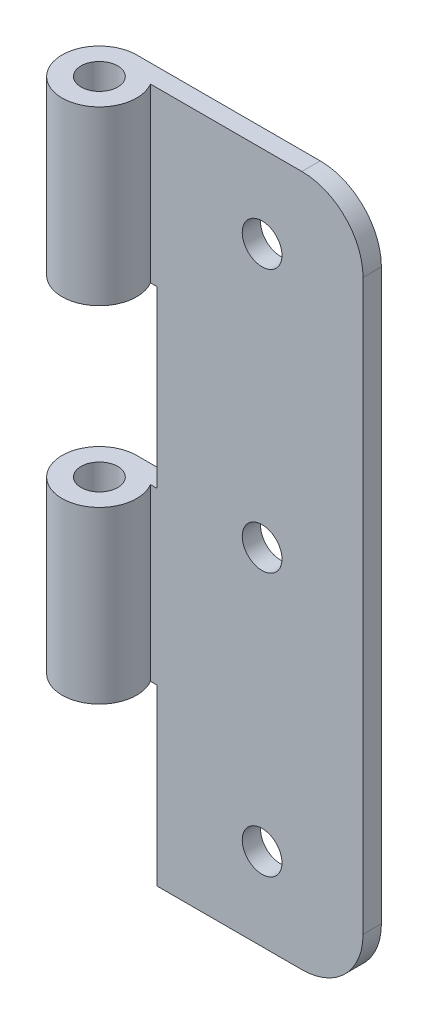
ISO-10303-21;
HEADER;
FILE_DESCRIPTION(('STEP AP214'),'2;1');
FILE_NAME('part.step','',(''),(''),'','','');
FILE_SCHEMA(('AUTOMOTIVE_DESIGN { 1 0 10303 214 1 1 1 1 }'));
ENDSEC;
DATA;
#1=APPLICATION_CONTEXT('core data for automotive mechanical design processes');
#2=APPLICATION_PROTOCOL_DEFINITION('international standard','automotive_design',2000,#1);
#3=PRODUCT_CONTEXT('',#1,'mechanical');
#4=PRODUCT('Part','Part','',(#3));
#5=PRODUCT_RELATED_PRODUCT_CATEGORY('part','',(#4));
#6=PRODUCT_DEFINITION_FORMATION('','',#4);
#7=PRODUCT_DEFINITION_CONTEXT('part definition',#1,'design');
#8=PRODUCT_DEFINITION('design','',#6,#7);
#9=PRODUCT_DEFINITION_SHAPE('','',#8);
#10=(LENGTH_UNIT() NAMED_UNIT(*) SI_UNIT(.MILLI.,.METRE.));
#11=(NAMED_UNIT(*) PLANE_ANGLE_UNIT() SI_UNIT($,.RADIAN.));
#12=(NAMED_UNIT(*) SI_UNIT($,.STERADIAN.) SOLID_ANGLE_UNIT());
#13=UNCERTAINTY_MEASURE_WITH_UNIT(LENGTH_MEASURE(1.E-05),#10,'distance_accuracy_value','');
#14=(GEOMETRIC_REPRESENTATION_CONTEXT(3) GLOBAL_UNCERTAINTY_ASSIGNED_CONTEXT((#13)) GLOBAL_UNIT_ASSIGNED_CONTEXT((#10,
#11,#12)) REPRESENTATION_CONTEXT('',''));
#15=CARTESIAN_POINT('',(0.,0.,0.));
#16=DIRECTION('',(0.,0.,1.));
#17=DIRECTION('',(1.,0.,0.));
#18=AXIS2_PLACEMENT_3D('',#15,#16,#17);
#19=CARTESIAN_POINT('',(0.,-56.5,0.));
#20=DIRECTION('',(0.,1.,0.));
#21=DIRECTION('',(0.,0.,1.));
#22=AXIS2_PLACEMENT_3D('',#19,#20,#21);
#23=CYLINDRICAL_SURFACE('',#22,3.);
#24=CARTESIAN_POINT('',(0.,56.5,0.));
#25=DIRECTION('',(0.,1.,0.));
#26=DIRECTION('',(0.,0.,1.));
#27=AXIS2_PLACEMENT_3D('',#24,#25,#26);
#28=CIRCLE('',#27,3.);
#29=CARTESIAN_POINT('',(0.,56.5,3.));
#30=VERTEX_POINT('',#29);
#31=EDGE_CURVE('E153',#30,#30,#28,.T.);
#32=ORIENTED_EDGE('',*,*,#31,.T.);
#33=EDGE_LOOP('',(#32));
#34=FACE_BOUND('',#33,.T.);
#35=CARTESIAN_POINT('',(0.,28.35,0.));
#36=DIRECTION('',(0.,1.,0.));
#37=DIRECTION('',(0.,0.,1.));
#38=AXIS2_PLACEMENT_3D('',#35,#36,#37);
#39=CIRCLE('',#38,3.);
#40=CARTESIAN_POINT('',(0.,28.35,3.));
#41=VERTEX_POINT('',#40);
#42=EDGE_CURVE('E183',#41,#41,#39,.F.);
#43=ORIENTED_EDGE('',*,*,#42,.T.);
#44=EDGE_LOOP('',(#43));
#45=FACE_BOUND('',#44,.T.);
#46=ADVANCED_FACE('F17',(#34,#45),#23,.F.);
#47=CARTESIAN_POINT('',(0.,-56.5,0.));
#48=DIRECTION('',(0.,1.,0.));
#49=DIRECTION('',(0.,0.,1.));
#50=AXIS2_PLACEMENT_3D('',#47,#48,#49);
#51=CYLINDRICAL_SURFACE('',#50,3.);
#52=CARTESIAN_POINT('',(0.,-0.199999999999999,0.));
#53=DIRECTION('',(0.,1.,0.));
#54=DIRECTION('',(0.,0.,1.));
#55=AXIS2_PLACEMENT_3D('',#52,#53,#54);
#56=CIRCLE('',#55,3.);
#57=CARTESIAN_POINT('',(0.,-0.199999999999999,3.));
#58=VERTEX_POINT('',#57);
#59=EDGE_CURVE('E144',#58,#58,#56,.T.);
#60=ORIENTED_EDGE('',*,*,#59,.T.);
#61=EDGE_LOOP('',(#60));
#62=FACE_BOUND('',#61,.T.);
#63=CARTESIAN_POINT('',(0.,-28.05,0.));
#64=DIRECTION('',(0.,1.,0.));
#65=DIRECTION('',(0.,0.,1.));
#66=AXIS2_PLACEMENT_3D('',#63,#64,#65);
#67=CIRCLE('',#66,3.);
#68=CARTESIAN_POINT('',(0.,-28.05,3.));
#69=VERTEX_POINT('',#68);
#70=EDGE_CURVE('E172',#69,#69,#67,.F.);
#71=ORIENTED_EDGE('',*,*,#70,.T.);
#72=EDGE_LOOP('',(#71));
#73=FACE_BOUND('',#72,.T.);
#74=ADVANCED_FACE('F481',(#62,#73),#51,.F.);
#75=CARTESIAN_POINT('',(30.,-46.5,-3.1));
#76=DIRECTION('',(0.,0.,1.));
#77=DIRECTION('',(1.,0.,0.));
#78=AXIS2_PLACEMENT_3D('',#75,#76,#77);
#79=PLANE('',#78);
#80=CARTESIAN_POINT('',(23.5,0.,-3.1));
#81=DIRECTION('',(0.,0.,-1.));
#82=DIRECTION('',(-1.,0.,0.));
#83=AXIS2_PLACEMENT_3D('',#80,#81,#82);
#84=CIRCLE('',#83,3.25);
#85=CARTESIAN_POINT('',(20.25,0.,-3.1));
#86=VERTEX_POINT('',#85);
#87=EDGE_CURVE('E167',#86,#86,#84,.T.);
#88=ORIENTED_EDGE('',*,*,#87,.T.);
#89=EDGE_LOOP('',(#88));
#90=FACE_BOUND('',#89,.T.);
#91=CARTESIAN_POINT('',(23.5,43.,-3.1));
#92=DIRECTION('',(0.,0.,-1.));
#93=DIRECTION('',(-1.,0.,0.));
#94=AXIS2_PLACEMENT_3D('',#91,#92,#93);
#95=CIRCLE('',#94,3.25);
#96=CARTESIAN_POINT('',(20.25,43.,-3.1));
#97=VERTEX_POINT('',#96);
#98=EDGE_CURVE('E132',#97,#97,#95,.T.);
#99=ORIENTED_EDGE('',*,*,#98,.T.);
#100=EDGE_LOOP('',(#99));
#101=FACE_BOUND('',#100,.T.);
#102=DIRECTION('',(0.,1.,0.));
#103=VECTOR('',#102,1.);
#104=CARTESIAN_POINT('',(5.25357021462548,-56.5,-3.1));
#105=LINE('',#104,#103);
#106=CARTESIAN_POINT('',(5.25357021462548,-28.05,-3.1));
#107=VERTEX_POINT('',#106);
#108=CARTESIAN_POINT('',(5.25357021462548,-0.199999999999999,-3.1));
#109=VERTEX_POINT('',#108);
#110=EDGE_CURVE('E141',#107,#109,#105,.T.);
#111=ORIENTED_EDGE('',*,*,#110,.F.);
#112=DIRECTION('',(-1.,0.,0.));
#113=VECTOR('',#112,1.);
#114=CARTESIAN_POINT('',(-6.1,-28.05,-3.10000000000001));
#115=LINE('',#114,#113);
#116=CARTESIAN_POINT('',(6.35,-28.05,-3.10000000000001));
#117=VERTEX_POINT('',#116);
#118=EDGE_CURVE('E175',#107,#117,#115,.F.);
#119=ORIENTED_EDGE('',*,*,#118,.T.);
#120=DIRECTION('',(0.,1.,0.));
#121=VECTOR('',#120,1.);
#122=CARTESIAN_POINT('',(6.35,-28.05,-3.10000000000001));
#123=LINE('',#122,#121);
#124=CARTESIAN_POINT('',(6.35,-56.5,-3.10000000000001));
#125=VERTEX_POINT('',#124);
#126=EDGE_CURVE('E135',#117,#125,#123,.F.);
#127=ORIENTED_EDGE('',*,*,#126,.T.);
#128=DIRECTION('',(1.,0.,0.));
#129=VECTOR('',#128,1.);
#130=CARTESIAN_POINT('',(6.1,-56.5,-3.10000000000001));
#131=LINE('',#130,#129);
#132=CARTESIAN_POINT('',(30.,-56.5,-3.1));
#133=VERTEX_POINT('',#132);
#134=EDGE_CURVE('E111',#125,#133,#131,.T.);
#135=ORIENTED_EDGE('',*,*,#134,.T.);
#136=CARTESIAN_POINT('',(30.,-46.5,-3.1));
#137=DIRECTION('',(0.,0.,1.));
#138=DIRECTION('',(1.,0.,0.));
#139=AXIS2_PLACEMENT_3D('',#136,#137,#138);
#140=CIRCLE('',#139,10.);
#141=CARTESIAN_POINT('',(40.,-46.5,-3.1));
#142=VERTEX_POINT('',#141);
#143=EDGE_CURVE('E105',#142,#133,#140,.F.);
#144=ORIENTED_EDGE('',*,*,#143,.F.);
#145=DIRECTION('',(0.,1.,0.));
#146=VECTOR('',#145,1.);
#147=CARTESIAN_POINT('',(40.,-46.5,-3.1));
#148=LINE('',#147,#146);
#149=CARTESIAN_POINT('',(40.,46.5,-3.1));
#150=VERTEX_POINT('',#149);
#151=EDGE_CURVE('E109',#142,#150,#148,.T.);
#152=ORIENTED_EDGE('',*,*,#151,.T.);
#153=CARTESIAN_POINT('',(30.,46.5,-3.1));
#154=DIRECTION('',(0.,0.,1.));
#155=DIRECTION('',(1.,0.,0.));
#156=AXIS2_PLACEMENT_3D('',#153,#154,#155);
#157=CIRCLE('',#156,10.);
#158=CARTESIAN_POINT('',(30.,56.5,-3.1));
#159=VERTEX_POINT('',#158);
#160=EDGE_CURVE('E122',#159,#150,#157,.F.);
#161=ORIENTED_EDGE('',*,*,#160,.F.);
#162=DIRECTION('',(1.,0.,0.));
#163=VECTOR('',#162,1.);
#164=CARTESIAN_POINT('',(0.,56.5,-3.1));
#165=LINE('',#164,#163);
#166=CARTESIAN_POINT('',(5.25357021462548,56.5,-3.1));
#167=VERTEX_POINT('',#166);
#168=EDGE_CURVE('E193',#159,#167,#165,.F.);
#169=ORIENTED_EDGE('',*,*,#168,.T.);
#170=DIRECTION('',(0.,1.,0.));
#171=VECTOR('',#170,1.);
#172=CARTESIAN_POINT('',(5.25357021462548,-56.5,-3.1));
#173=LINE('',#172,#171);
#174=CARTESIAN_POINT('',(5.25357021462548,28.35,-3.1));
#175=VERTEX_POINT('',#174);
#176=EDGE_CURVE('E151',#175,#167,#173,.T.);
#177=ORIENTED_EDGE('',*,*,#176,.F.);
#178=DIRECTION('',(-1.,0.,0.));
#179=VECTOR('',#178,1.);
#180=CARTESIAN_POINT('',(-6.1,28.35,-3.10000000000001));
#181=LINE('',#180,#179);
#182=CARTESIAN_POINT('',(6.35,28.35,-3.10000000000001));
#183=VERTEX_POINT('',#182);
#184=EDGE_CURVE('E186',#175,#183,#181,.F.);
#185=ORIENTED_EDGE('',*,*,#184,.T.);
#186=DIRECTION('',(0.,1.,0.));
#187=VECTOR('',#186,1.);
#188=CARTESIAN_POINT('',(6.35,28.35,-3.10000000000001));
#189=LINE('',#188,#187);
#190=CARTESIAN_POINT('',(6.35,-0.199999999999998,-3.10000000000001));
#191=VERTEX_POINT('',#190);
#192=EDGE_CURVE('E145',#183,#191,#189,.F.);
#193=ORIENTED_EDGE('',*,*,#192,.T.);
#194=DIRECTION('',(1.,0.,0.));
#195=VECTOR('',#194,1.);
#196=CARTESIAN_POINT('',(6.35,-0.199999999999999,-3.10000000000001));
#197=LINE('',#196,#195);
#198=EDGE_CURVE('E182',#191,#109,#197,.F.);
#199=ORIENTED_EDGE('',*,*,#198,.T.);
#200=EDGE_LOOP('',(#111,#119,#127,#135,#144,#152,#161,#169,#177,#185,#193,#199));
#201=FACE_BOUND('',#200,.T.);
#202=CARTESIAN_POINT('',(23.5,-43.,-3.1));
#203=DIRECTION('',(0.,0.,-1.));
#204=DIRECTION('',(-1.,0.,0.));
#205=AXIS2_PLACEMENT_3D('',#202,#203,#204);
#206=CIRCLE('',#205,3.25);
#207=CARTESIAN_POINT('',(20.25,-43.,-3.1));
#208=VERTEX_POINT('',#207);
#209=EDGE_CURVE('E20',#208,#208,#206,.T.);
#210=ORIENTED_EDGE('',*,*,#209,.T.);
#211=EDGE_LOOP('',(#210));
#212=FACE_BOUND('',#211,.T.);
#213=ADVANCED_FACE('F107',(#90,#101,#201,#212),#79,.T.);
#214=CARTESIAN_POINT('',(23.5,-43.,-3.1));
#215=DIRECTION('',(0.,0.,-1.));
#216=DIRECTION('',(-1.,0.,0.));
#217=AXIS2_PLACEMENT_3D('',#214,#215,#216);
#218=CYLINDRICAL_SURFACE('',#217,3.25);
#219=CARTESIAN_POINT('',(23.5,-43.,-6.1));
#220=DIRECTION('',(0.,0.,-1.));
#221=DIRECTION('',(-1.,0.,0.));
#222=AXIS2_PLACEMENT_3D('',#219,#220,#221);
#223=CIRCLE('',#222,3.25);
#224=CARTESIAN_POINT('',(20.25,-43.,-6.1));
#225=VERTEX_POINT('',#224);
#226=EDGE_CURVE('E164',#225,#225,#223,.T.);
#227=ORIENTED_EDGE('',*,*,#226,.T.);
#228=EDGE_LOOP('',(#227));
#229=FACE_BOUND('',#228,.T.);
#230=ORIENTED_EDGE('',*,*,#209,.F.);
#231=EDGE_LOOP('',(#230));
#232=FACE_BOUND('',#231,.T.);
#233=ADVANCED_FACE('F463',(#229,#232),#218,.F.);
#234=CARTESIAN_POINT('',(30.,-46.5,-3.1));
#235=DIRECTION('',(0.,0.,1.));
#236=DIRECTION('',(1.,0.,0.));
#237=AXIS2_PLACEMENT_3D('',#234,#235,#236);
#238=CYLINDRICAL_SURFACE('',#237,10.);
#239=ORIENTED_EDGE('',*,*,#143,.T.);
#240=DIRECTION('',(0.,0.,1.));
#241=VECTOR('',#240,1.);
#242=CARTESIAN_POINT('',(30.,-56.5,0.));
#243=LINE('',#242,#241);
#244=CARTESIAN_POINT('',(30.,-56.5,-6.1));
#245=VERTEX_POINT('',#244);
#246=EDGE_CURVE('E137',#133,#245,#243,.F.);
#247=ORIENTED_EDGE('',*,*,#246,.T.);
#248=CARTESIAN_POINT('',(30.,-46.5,-6.1));
#249=DIRECTION('',(0.,0.,1.));
#250=DIRECTION('',(1.,0.,0.));
#251=AXIS2_PLACEMENT_3D('',#248,#249,#250);
#252=CIRCLE('',#251,10.);
#253=CARTESIAN_POINT('',(40.,-46.5,-6.1));
#254=VERTEX_POINT('',#253);
#255=EDGE_CURVE('E126',#245,#254,#252,.T.);
#256=ORIENTED_EDGE('',*,*,#255,.T.);
#257=DIRECTION('',(0.,0.,1.));
#258=VECTOR('',#257,1.);
#259=CARTESIAN_POINT('',(40.,-46.5,-3.1));
#260=LINE('',#259,#258);
#261=EDGE_CURVE('E116',#254,#142,#260,.T.);
#262=ORIENTED_EDGE('',*,*,#261,.T.);
#263=EDGE_LOOP('',(#239,#247,#256,#262));
#264=FACE_BOUND('',#263,.T.);
#265=ADVANCED_FACE('F125',(#264),#238,.T.);
#266=CARTESIAN_POINT('',(40.,-46.5,-3.1));
#267=DIRECTION('',(-1.,0.,0.));
#268=DIRECTION('',(0.,0.,1.));
#269=AXIS2_PLACEMENT_3D('',#266,#267,#268);
#270=PLANE('',#269);
#271=DIRECTION('',(0.,0.,1.));
#272=VECTOR('',#271,1.);
#273=CARTESIAN_POINT('',(40.,46.5,-3.1));
#274=LINE('',#273,#272);
#275=CARTESIAN_POINT('',(40.,46.5,-6.1));
#276=VERTEX_POINT('',#275);
#277=EDGE_CURVE('E121',#150,#276,#274,.F.);
#278=ORIENTED_EDGE('',*,*,#277,.F.);
#279=ORIENTED_EDGE('',*,*,#151,.F.);
#280=ORIENTED_EDGE('',*,*,#261,.F.);
#281=DIRECTION('',(0.,1.,0.));
#282=VECTOR('',#281,1.);
#283=CARTESIAN_POINT('',(40.,-46.5,-6.1));
#284=LINE('',#283,#282);
#285=EDGE_CURVE('E162',#254,#276,#284,.T.);
#286=ORIENTED_EDGE('',*,*,#285,.T.);
#287=EDGE_LOOP('',(#278,#279,#280,#286));
#288=FACE_BOUND('',#287,.T.);
#289=ADVANCED_FACE('F118',(#288),#270,.F.);
#290=CARTESIAN_POINT('',(30.,46.5,-3.1));
#291=DIRECTION('',(0.,0.,1.));
#292=DIRECTION('',(1.,0.,0.));
#293=AXIS2_PLACEMENT_3D('',#290,#291,#292);
#294=CYLINDRICAL_SURFACE('',#293,10.);
#295=ORIENTED_EDGE('',*,*,#160,.T.);
#296=ORIENTED_EDGE('',*,*,#277,.T.);
#297=CARTESIAN_POINT('',(30.,46.5,-6.1));
#298=DIRECTION('',(0.,0.,1.));
#299=DIRECTION('',(1.,0.,0.));
#300=AXIS2_PLACEMENT_3D('',#297,#298,#299);
#301=CIRCLE('',#300,10.);
#302=CARTESIAN_POINT('',(30.,56.5,-6.1));
#303=VERTEX_POINT('',#302);
#304=EDGE_CURVE('E158',#276,#303,#301,.T.);
#305=ORIENTED_EDGE('',*,*,#304,.T.);
#306=DIRECTION('',(0.,0.,-1.));
#307=VECTOR('',#306,1.);
#308=CARTESIAN_POINT('',(30.,56.5,0.));
#309=LINE('',#308,#307);
#310=EDGE_CURVE('E196',#303,#159,#309,.F.);
#311=ORIENTED_EDGE('',*,*,#310,.T.);
#312=EDGE_LOOP('',(#295,#296,#305,#311));
#313=FACE_BOUND('',#312,.T.);
#314=ADVANCED_FACE('F299',(#313),#294,.T.);
#315=CARTESIAN_POINT('',(0.,56.5,0.));
#316=DIRECTION('',(0.,-1.,0.));
#317=DIRECTION('',(0.,0.,-1.));
#318=AXIS2_PLACEMENT_3D('',#315,#316,#317);
#319=PLANE('',#318);
#320=ORIENTED_EDGE('',*,*,#31,.F.);
#321=EDGE_LOOP('',(#320));
#322=FACE_BOUND('',#321,.T.);
#323=ORIENTED_EDGE('',*,*,#168,.F.);
#324=ORIENTED_EDGE('',*,*,#310,.F.);
#325=DIRECTION('',(1.,0.,0.));
#326=VECTOR('',#325,1.);
#327=CARTESIAN_POINT('',(30.,56.5,-6.1));
#328=LINE('',#327,#326);
#329=CARTESIAN_POINT('',(0.,56.5,-6.1));
#330=VERTEX_POINT('',#329);
#331=EDGE_CURVE('E161',#303,#330,#328,.F.);
#332=ORIENTED_EDGE('',*,*,#331,.T.);
#333=CARTESIAN_POINT('',(0.,56.5,0.));
#334=DIRECTION('',(0.,1.,0.));
#335=DIRECTION('',(0.,0.,1.));
#336=AXIS2_PLACEMENT_3D('',#333,#334,#335);
#337=CIRCLE('',#336,6.1);
#338=EDGE_CURVE('E152',#167,#330,#337,.F.);
#339=ORIENTED_EDGE('',*,*,#338,.F.);
#340=EDGE_LOOP('',(#323,#324,#332,#339));
#341=FACE_BOUND('',#340,.T.);
#342=ADVANCED_FACE('F298',(#322,#341),#319,.F.);
#343=CARTESIAN_POINT('',(0.,-56.5,0.));
#344=DIRECTION('',(0.,1.,0.));
#345=DIRECTION('',(0.,0.,1.));
#346=AXIS2_PLACEMENT_3D('',#343,#344,#345);
#347=CYLINDRICAL_SURFACE('',#346,6.1);
#348=ORIENTED_EDGE('',*,*,#176,.T.);
#349=ORIENTED_EDGE('',*,*,#338,.T.);
#350=DIRECTION('',(0.,1.,0.));
#351=VECTOR('',#350,1.);
#352=CARTESIAN_POINT('',(0.,-46.5,-6.1));
#353=LINE('',#352,#351);
#354=CARTESIAN_POINT('',(0.,28.35,-6.1));
#355=VERTEX_POINT('',#354);
#356=EDGE_CURVE('E201',#330,#355,#353,.F.);
#357=ORIENTED_EDGE('',*,*,#356,.T.);
#358=CARTESIAN_POINT('',(0.,28.35,0.));
#359=DIRECTION('',(0.,1.,0.));
#360=DIRECTION('',(0.,0.,1.));
#361=AXIS2_PLACEMENT_3D('',#358,#359,#360);
#362=CIRCLE('',#361,6.1);
#363=EDGE_CURVE('E187',#355,#175,#362,.T.);
#364=ORIENTED_EDGE('',*,*,#363,.T.);
#365=EDGE_LOOP('',(#348,#349,#357,#364));
#366=FACE_BOUND('',#365,.T.);
#367=ADVANCED_FACE('F294',(#366),#347,.T.);
#368=CARTESIAN_POINT('',(-6.1,28.35,113.));
#369=DIRECTION('',(0.,1.,0.));
#370=DIRECTION('',(-1.,0.,0.));
#371=AXIS2_PLACEMENT_3D('',#368,#369,#370);
#372=PLANE('',#371);
#373=ORIENTED_EDGE('',*,*,#42,.F.);
#374=EDGE_LOOP('',(#373));
#375=FACE_BOUND('',#374,.T.);
#376=ORIENTED_EDGE('',*,*,#363,.F.);
#377=DIRECTION('',(1.,0.,0.));
#378=VECTOR('',#377,1.);
#379=CARTESIAN_POINT('',(30.,28.35,-6.1));
#380=LINE('',#379,#378);
#381=CARTESIAN_POINT('',(6.35,28.35,-6.1));
#382=VERTEX_POINT('',#381);
#383=EDGE_CURVE('E204',#355,#382,#380,.T.);
#384=ORIENTED_EDGE('',*,*,#383,.T.);
#385=DIRECTION('',(0.,0.,-1.));
#386=VECTOR('',#385,1.);
#387=CARTESIAN_POINT('',(6.35,28.35,113.));
#388=LINE('',#387,#386);
#389=EDGE_CURVE('E148',#382,#183,#388,.F.);
#390=ORIENTED_EDGE('',*,*,#389,.T.);
#391=ORIENTED_EDGE('',*,*,#184,.F.);
#392=EDGE_LOOP('',(#376,#384,#390,#391));
#393=FACE_BOUND('',#392,.T.);
#394=ADVANCED_FACE('F290',(#375,#393),#372,.F.);
#395=CARTESIAN_POINT('',(6.35,28.35,113.));
#396=DIRECTION('',(1.,0.,0.));
#397=DIRECTION('',(0.,0.,-1.));
#398=AXIS2_PLACEMENT_3D('',#395,#396,#397);
#399=PLANE('',#398);
#400=ORIENTED_EDGE('',*,*,#389,.F.);
#401=DIRECTION('',(0.,1.,0.));
#402=VECTOR('',#401,1.);
#403=CARTESIAN_POINT('',(6.35,-46.5,-6.1));
#404=LINE('',#403,#402);
#405=CARTESIAN_POINT('',(6.35,-0.199999999999994,-6.1));
#406=VERTEX_POINT('',#405);
#407=EDGE_CURVE('E212',#382,#406,#404,.F.);
#408=ORIENTED_EDGE('',*,*,#407,.T.);
#409=DIRECTION('',(0.,0.,-1.));
#410=VECTOR('',#409,1.);
#411=CARTESIAN_POINT('',(6.35,-0.199999999999999,113.));
#412=LINE('',#411,#410);
#413=EDGE_CURVE('E147',#406,#191,#412,.F.);
#414=ORIENTED_EDGE('',*,*,#413,.T.);
#415=ORIENTED_EDGE('',*,*,#192,.F.);
#416=EDGE_LOOP('',(#400,#408,#414,#415));
#417=FACE_BOUND('',#416,.T.);
#418=ADVANCED_FACE('F286',(#417),#399,.F.);
#419=CARTESIAN_POINT('',(6.35,-0.199999999999999,113.));
#420=DIRECTION('',(0.,-1.,0.));
#421=DIRECTION('',(0.,0.,-1.));
#422=AXIS2_PLACEMENT_3D('',#419,#420,#421);
#423=PLANE('',#422);
#424=ORIENTED_EDGE('',*,*,#59,.F.);
#425=EDGE_LOOP('',(#424));
#426=FACE_BOUND('',#425,.T.);
#427=ORIENTED_EDGE('',*,*,#413,.F.);
#428=DIRECTION('',(1.,0.,0.));
#429=VECTOR('',#428,1.);
#430=CARTESIAN_POINT('',(30.,-0.199999999999992,-6.1));
#431=LINE('',#430,#429);
#432=CARTESIAN_POINT('',(0.,-0.199999999999995,-6.1));
#433=VERTEX_POINT('',#432);
#434=EDGE_CURVE('E221',#406,#433,#431,.F.);
#435=ORIENTED_EDGE('',*,*,#434,.T.);
#436=CARTESIAN_POINT('',(0.,-0.199999999999999,0.));
#437=DIRECTION('',(0.,1.,0.));
#438=DIRECTION('',(0.,0.,1.));
#439=AXIS2_PLACEMENT_3D('',#436,#437,#438);
#440=CIRCLE('',#439,6.1);
#441=EDGE_CURVE('E143',#109,#433,#440,.F.);
#442=ORIENTED_EDGE('',*,*,#441,.F.);
#443=ORIENTED_EDGE('',*,*,#198,.F.);
#444=EDGE_LOOP('',(#427,#435,#442,#443));
#445=FACE_BOUND('',#444,.T.);
#446=ADVANCED_FACE('F282',(#426,#445),#423,.F.);
#447=CARTESIAN_POINT('',(0.,-56.5,0.));
#448=DIRECTION('',(0.,1.,0.));
#449=DIRECTION('',(0.,0.,1.));
#450=AXIS2_PLACEMENT_3D('',#447,#448,#449);
#451=CYLINDRICAL_SURFACE('',#450,6.1);
#452=ORIENTED_EDGE('',*,*,#110,.T.);
#453=ORIENTED_EDGE('',*,*,#441,.T.);
#454=DIRECTION('',(0.,1.,0.));
#455=VECTOR('',#454,1.);
#456=CARTESIAN_POINT('',(0.,-46.5,-6.1));
#457=LINE('',#456,#455);
#458=CARTESIAN_POINT('',(0.,-28.05,-6.1));
#459=VERTEX_POINT('',#458);
#460=EDGE_CURVE('E234',#433,#459,#457,.F.);
#461=ORIENTED_EDGE('',*,*,#460,.T.);
#462=CARTESIAN_POINT('',(0.,-28.05,0.));
#463=DIRECTION('',(0.,1.,0.));
#464=DIRECTION('',(0.,0.,1.));
#465=AXIS2_PLACEMENT_3D('',#462,#463,#464);
#466=CIRCLE('',#465,6.1);
#467=EDGE_CURVE('E176',#459,#107,#466,.T.);
#468=ORIENTED_EDGE('',*,*,#467,.T.);
#469=EDGE_LOOP('',(#452,#453,#461,#468));
#470=FACE_BOUND('',#469,.T.);
#471=ADVANCED_FACE('F278',(#470),#451,.T.);
#472=CARTESIAN_POINT('',(-6.1,-28.05,113.));
#473=DIRECTION('',(0.,1.,0.));
#474=DIRECTION('',(-1.,0.,0.));
#475=AXIS2_PLACEMENT_3D('',#472,#473,#474);
#476=PLANE('',#475);
#477=ORIENTED_EDGE('',*,*,#70,.F.);
#478=EDGE_LOOP('',(#477));
#479=FACE_BOUND('',#478,.T.);
#480=ORIENTED_EDGE('',*,*,#467,.F.);
#481=DIRECTION('',(1.,0.,0.));
#482=VECTOR('',#481,1.);
#483=CARTESIAN_POINT('',(30.,-28.05,-6.1));
#484=LINE('',#483,#482);
#485=CARTESIAN_POINT('',(6.35,-28.05,-6.1));
#486=VERTEX_POINT('',#485);
#487=EDGE_CURVE('E237',#459,#486,#484,.T.);
#488=ORIENTED_EDGE('',*,*,#487,.T.);
#489=DIRECTION('',(0.,0.,-1.));
#490=VECTOR('',#489,1.);
#491=CARTESIAN_POINT('',(6.35,-28.05,113.));
#492=LINE('',#491,#490);
#493=EDGE_CURVE('E138',#486,#117,#492,.F.);
#494=ORIENTED_EDGE('',*,*,#493,.T.);
#495=ORIENTED_EDGE('',*,*,#118,.F.);
#496=EDGE_LOOP('',(#480,#488,#494,#495));
#497=FACE_BOUND('',#496,.T.);
#498=ADVANCED_FACE('F274',(#479,#497),#476,.F.);
#499=CARTESIAN_POINT('',(6.35,-28.05,113.));
#500=DIRECTION('',(1.,0.,0.));
#501=DIRECTION('',(0.,0.,-1.));
#502=AXIS2_PLACEMENT_3D('',#499,#500,#501);
#503=PLANE('',#502);
#504=ORIENTED_EDGE('',*,*,#493,.F.);
#505=DIRECTION('',(0.,1.,0.));
#506=VECTOR('',#505,1.);
#507=CARTESIAN_POINT('',(6.35,-46.5,-6.1));
#508=LINE('',#507,#506);
#509=CARTESIAN_POINT('',(6.35,-56.5,-6.1));
#510=VERTEX_POINT('',#509);
#511=EDGE_CURVE('E245',#486,#510,#508,.F.);
#512=ORIENTED_EDGE('',*,*,#511,.T.);
#513=DIRECTION('',(0.,0.,1.));
#514=VECTOR('',#513,1.);
#515=CARTESIAN_POINT('',(6.35,-56.5,0.));
#516=LINE('',#515,#514);
#517=EDGE_CURVE('E35',#510,#125,#516,.T.);
#518=ORIENTED_EDGE('',*,*,#517,.T.);
#519=ORIENTED_EDGE('',*,*,#126,.F.);
#520=EDGE_LOOP('',(#504,#512,#518,#519));
#521=FACE_BOUND('',#520,.T.);
#522=ADVANCED_FACE('F270',(#521),#503,.F.);
#523=CARTESIAN_POINT('',(6.1,-56.5,0.));
#524=DIRECTION('',(0.,1.,0.));
#525=DIRECTION('',(0.,0.,1.));
#526=AXIS2_PLACEMENT_3D('',#523,#524,#525);
#527=PLANE('',#526);
#528=ORIENTED_EDGE('',*,*,#517,.F.);
#529=DIRECTION('',(1.,0.,0.));
#530=VECTOR('',#529,1.);
#531=CARTESIAN_POINT('',(30.,-56.5,-6.1));
#532=LINE('',#531,#530);
#533=EDGE_CURVE('E157',#510,#245,#532,.T.);
#534=ORIENTED_EDGE('',*,*,#533,.T.);
#535=ORIENTED_EDGE('',*,*,#246,.F.);
#536=ORIENTED_EDGE('',*,*,#134,.F.);
#537=EDGE_LOOP('',(#528,#534,#535,#536));
#538=FACE_BOUND('',#537,.T.);
#539=ADVANCED_FACE('F263',(#538),#527,.F.);
#540=CARTESIAN_POINT('',(23.5,43.,-3.1));
#541=DIRECTION('',(0.,0.,-1.));
#542=DIRECTION('',(-1.,0.,0.));
#543=AXIS2_PLACEMENT_3D('',#540,#541,#542);
#544=CYLINDRICAL_SURFACE('',#543,3.25);
#545=CARTESIAN_POINT('',(23.5,43.,-6.1));
#546=DIRECTION('',(0.,0.,-1.));
#547=DIRECTION('',(-1.,0.,0.));
#548=AXIS2_PLACEMENT_3D('',#545,#546,#547);
#549=CIRCLE('',#548,3.25);
#550=CARTESIAN_POINT('',(20.25,43.,-6.1));
#551=VERTEX_POINT('',#550);
#552=EDGE_CURVE('E26',#551,#551,#549,.T.);
#553=ORIENTED_EDGE('',*,*,#552,.T.);
#554=EDGE_LOOP('',(#553));
#555=FACE_BOUND('',#554,.T.);
#556=ORIENTED_EDGE('',*,*,#98,.F.);
#557=EDGE_LOOP('',(#556));
#558=FACE_BOUND('',#557,.T.);
#559=ADVANCED_FACE('F317',(#555,#558),#544,.F.);
#560=CARTESIAN_POINT('',(23.5,0.,-3.1));
#561=DIRECTION('',(0.,0.,-1.));
#562=DIRECTION('',(-1.,0.,0.));
#563=AXIS2_PLACEMENT_3D('',#560,#561,#562);
#564=CYLINDRICAL_SURFACE('',#563,3.25);
#565=CARTESIAN_POINT('',(23.5,0.,-6.1));
#566=DIRECTION('',(0.,0.,-1.));
#567=DIRECTION('',(-1.,0.,0.));
#568=AXIS2_PLACEMENT_3D('',#565,#566,#567);
#569=CIRCLE('',#568,3.25);
#570=CARTESIAN_POINT('',(20.25,0.,-6.1));
#571=VERTEX_POINT('',#570);
#572=EDGE_CURVE('E11',#571,#571,#569,.T.);
#573=ORIENTED_EDGE('',*,*,#572,.T.);
#574=EDGE_LOOP('',(#573));
#575=FACE_BOUND('',#574,.T.);
#576=ORIENTED_EDGE('',*,*,#87,.F.);
#577=EDGE_LOOP('',(#576));
#578=FACE_BOUND('',#577,.T.);
#579=ADVANCED_FACE('F311',(#575,#578),#564,.F.);
#580=CARTESIAN_POINT('',(30.,-46.5,-6.1));
#581=DIRECTION('',(0.,0.,1.));
#582=DIRECTION('',(1.,0.,0.));
#583=AXIS2_PLACEMENT_3D('',#580,#581,#582);
#584=PLANE('',#583);
#585=ORIENTED_EDGE('',*,*,#572,.F.);
#586=EDGE_LOOP('',(#585));
#587=FACE_BOUND('',#586,.T.);
#588=ORIENTED_EDGE('',*,*,#552,.F.);
#589=EDGE_LOOP('',(#588));
#590=FACE_BOUND('',#589,.T.);
#591=ORIENTED_EDGE('',*,*,#511,.F.);
#592=ORIENTED_EDGE('',*,*,#487,.F.);
#593=ORIENTED_EDGE('',*,*,#460,.F.);
#594=ORIENTED_EDGE('',*,*,#434,.F.);
#595=ORIENTED_EDGE('',*,*,#407,.F.);
#596=ORIENTED_EDGE('',*,*,#383,.F.);
#597=ORIENTED_EDGE('',*,*,#356,.F.);
#598=ORIENTED_EDGE('',*,*,#331,.F.);
#599=ORIENTED_EDGE('',*,*,#304,.F.);
#600=ORIENTED_EDGE('',*,*,#285,.F.);
#601=ORIENTED_EDGE('',*,*,#255,.F.);
#602=ORIENTED_EDGE('',*,*,#533,.F.);
#603=EDGE_LOOP('',(#591,#592,#593,#594,#595,#596,#597,#598,#599,#600,#601,#602));
#604=FACE_BOUND('',#603,.T.);
#605=ORIENTED_EDGE('',*,*,#226,.F.);
#606=EDGE_LOOP('',(#605));
#607=FACE_BOUND('',#606,.T.);
#608=ADVANCED_FACE('F266',(#587,#590,#604,#607),#584,.F.);
#609=CLOSED_SHELL('',(#46,#74,#213,#233,#265,#289,#314,#342,#367,#394,#418,#446,#471,#498,#522,
#539,#559,#579,#608));
#610=MANIFOLD_SOLID_BREP('B1',#609);
#611=ADVANCED_BREP_SHAPE_REPRESENTATION('',(#18,#610),#14);
#612=SHAPE_DEFINITION_REPRESENTATION(#9,#611);
ENDSEC;
END-ISO-10303-21;
